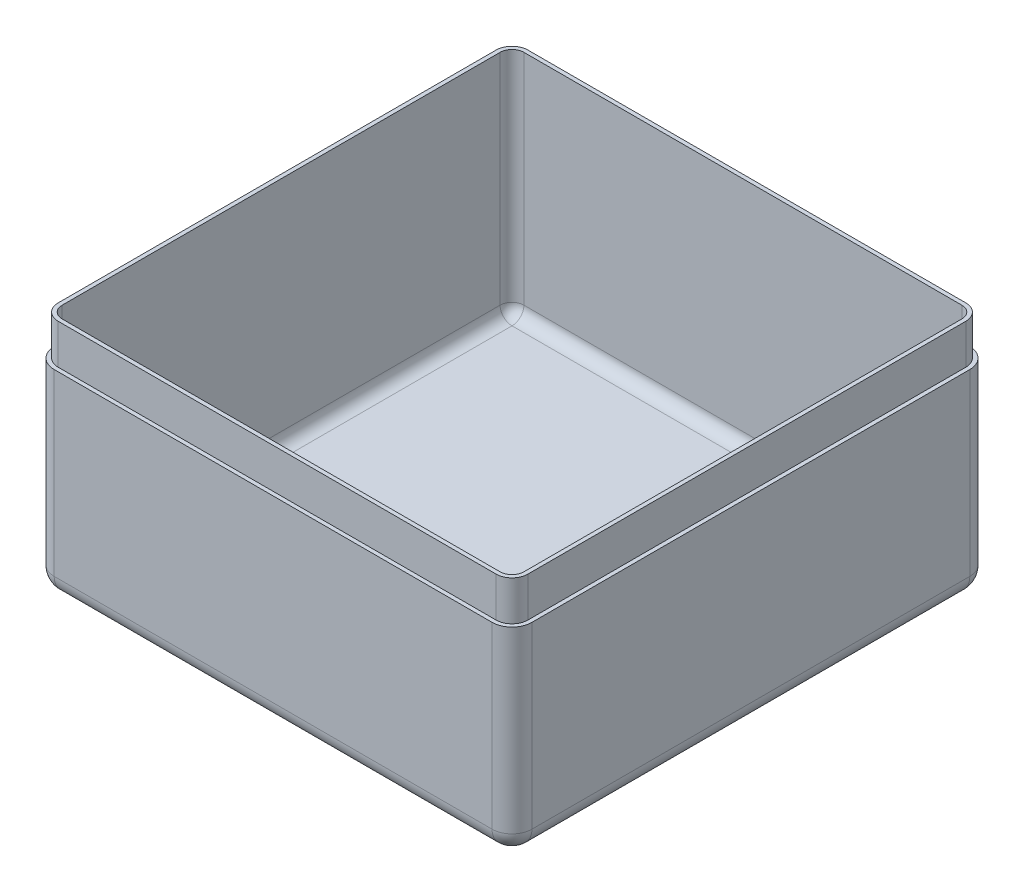
ISO-10303-21;
HEADER;
FILE_DESCRIPTION(('STEP AP214'),'2;1');
FILE_NAME('part.step','',(''),(''),'','','');
FILE_SCHEMA(('AUTOMOTIVE_DESIGN { 1 0 10303 214 1 1 1 1 }'));
ENDSEC;
DATA;
#1=APPLICATION_CONTEXT('core data for automotive mechanical design processes');
#2=APPLICATION_PROTOCOL_DEFINITION('international standard','automotive_design',2000,#1);
#3=PRODUCT_CONTEXT('',#1,'mechanical');
#4=PRODUCT('Part','Part','',(#3));
#5=PRODUCT_RELATED_PRODUCT_CATEGORY('part','',(#4));
#6=PRODUCT_DEFINITION_FORMATION('','',#4);
#7=PRODUCT_DEFINITION_CONTEXT('part definition',#1,'design');
#8=PRODUCT_DEFINITION('design','',#6,#7);
#9=PRODUCT_DEFINITION_SHAPE('','',#8);
#10=(LENGTH_UNIT() NAMED_UNIT(*) SI_UNIT(.MILLI.,.METRE.));
#11=(NAMED_UNIT(*) PLANE_ANGLE_UNIT() SI_UNIT($,.RADIAN.));
#12=(NAMED_UNIT(*) SI_UNIT($,.STERADIAN.) SOLID_ANGLE_UNIT());
#13=UNCERTAINTY_MEASURE_WITH_UNIT(LENGTH_MEASURE(1.E-05),#10,'distance_accuracy_value','');
#14=(GEOMETRIC_REPRESENTATION_CONTEXT(3) GLOBAL_UNCERTAINTY_ASSIGNED_CONTEXT((#13)) GLOBAL_UNIT_ASSIGNED_CONTEXT((#10,
#11,#12)) REPRESENTATION_CONTEXT('',''));
#15=CARTESIAN_POINT('',(0.,0.,0.));
#16=DIRECTION('',(0.,0.,1.));
#17=DIRECTION('',(1.,0.,0.));
#18=AXIS2_PLACEMENT_3D('',#15,#16,#17);
#19=CARTESIAN_POINT('',(0.,25.,0.));
#20=DIRECTION('',(0.,-1.,0.));
#21=DIRECTION('',(0.,0.,-1.));
#22=AXIS2_PLACEMENT_3D('',#19,#20,#21);
#23=PLANE('',#22);
#24=DIRECTION('',(-1.,0.,0.));
#25=VECTOR('',#24,1.);
#26=CARTESIAN_POINT('',(0.,25.,-60.));
#27=LINE('',#26,#25);
#28=CARTESIAN_POINT('',(57.5,25.,-60.));
#29=VERTEX_POINT('',#28);
#30=CARTESIAN_POINT('',(2.49999999999998,25.,-60.));
#31=VERTEX_POINT('',#30);
#32=EDGE_CURVE('E392',#29,#31,#27,.T.);
#33=ORIENTED_EDGE('',*,*,#32,.T.);
#34=CARTESIAN_POINT('',(2.49999999999998,25.,-57.5));
#35=DIRECTION('',(0.,-1.,0.));
#36=DIRECTION('',(0.,0.,-1.));
#37=AXIS2_PLACEMENT_3D('',#34,#35,#36);
#38=CIRCLE('',#37,2.5);
#39=CARTESIAN_POINT('',(0.,25.,-57.5));
#40=VERTEX_POINT('',#39);
#41=EDGE_CURVE('E11',#31,#40,#38,.F.);
#42=ORIENTED_EDGE('',*,*,#41,.T.);
#43=DIRECTION('',(0.,0.,1.));
#44=VECTOR('',#43,1.);
#45=CARTESIAN_POINT('',(0.,25.,0.));
#46=LINE('',#45,#44);
#47=CARTESIAN_POINT('',(0.,25.,-2.5));
#48=VERTEX_POINT('',#47);
#49=EDGE_CURVE('E383',#40,#48,#46,.T.);
#50=ORIENTED_EDGE('',*,*,#49,.T.);
#51=CARTESIAN_POINT('',(2.5,25.,-2.5));
#52=DIRECTION('',(0.,-1.,0.));
#53=DIRECTION('',(0.,0.,-1.));
#54=AXIS2_PLACEMENT_3D('',#51,#52,#53);
#55=CIRCLE('',#54,2.5);
#56=CARTESIAN_POINT('',(2.5,25.,0.));
#57=VERTEX_POINT('',#56);
#58=EDGE_CURVE('E429',#48,#57,#55,.F.);
#59=ORIENTED_EDGE('',*,*,#58,.T.);
#60=DIRECTION('',(1.,0.,0.));
#61=VECTOR('',#60,1.);
#62=CARTESIAN_POINT('',(0.,25.,0.));
#63=LINE('',#62,#61);
#64=CARTESIAN_POINT('',(57.5,25.,0.));
#65=VERTEX_POINT('',#64);
#66=EDGE_CURVE('E386',#57,#65,#63,.T.);
#67=ORIENTED_EDGE('',*,*,#66,.T.);
#68=CARTESIAN_POINT('',(57.5,25.,-2.5));
#69=DIRECTION('',(0.,-1.,0.));
#70=DIRECTION('',(0.,0.,-1.));
#71=AXIS2_PLACEMENT_3D('',#68,#69,#70);
#72=CIRCLE('',#71,2.5);
#73=CARTESIAN_POINT('',(60.,25.,-2.5));
#74=VERTEX_POINT('',#73);
#75=EDGE_CURVE('E431',#65,#74,#72,.F.);
#76=ORIENTED_EDGE('',*,*,#75,.T.);
#77=DIRECTION('',(0.,0.,-1.));
#78=VECTOR('',#77,1.);
#79=CARTESIAN_POINT('',(60.,25.,0.));
#80=LINE('',#79,#78);
#81=CARTESIAN_POINT('',(60.,25.,-57.5));
#82=VERTEX_POINT('',#81);
#83=EDGE_CURVE('E389',#74,#82,#80,.T.);
#84=ORIENTED_EDGE('',*,*,#83,.T.);
#85=CARTESIAN_POINT('',(57.5,25.,-57.5));
#86=DIRECTION('',(0.,-1.,0.));
#87=DIRECTION('',(0.,0.,-1.));
#88=AXIS2_PLACEMENT_3D('',#85,#86,#87);
#89=CIRCLE('',#88,2.5);
#90=EDGE_CURVE('E42',#82,#29,#89,.F.);
#91=ORIENTED_EDGE('',*,*,#90,.T.);
#92=EDGE_LOOP('',(#33,#42,#50,#59,#67,#76,#84,#91));
#93=FACE_BOUND('',#92,.T.);
#94=CARTESIAN_POINT('',(57.5,25.,-57.5));
#95=DIRECTION('',(0.,1.,0.));
#96=DIRECTION('',(0.,0.,1.));
#97=AXIS2_PLACEMENT_3D('',#94,#95,#96);
#98=CIRCLE('',#97,2.);
#99=CARTESIAN_POINT('',(59.5,25.,-57.5));
#100=VERTEX_POINT('',#99);
#101=CARTESIAN_POINT('',(57.5,25.,-59.5));
#102=VERTEX_POINT('',#101);
#103=EDGE_CURVE('E259',#100,#102,#98,.T.);
#104=ORIENTED_EDGE('',*,*,#103,.F.);
#105=DIRECTION('',(0.,0.,-1.));
#106=VECTOR('',#105,1.);
#107=CARTESIAN_POINT('',(59.5,25.,-2.5));
#108=LINE('',#107,#106);
#109=CARTESIAN_POINT('',(59.5,25.,-2.5));
#110=VERTEX_POINT('',#109);
#111=EDGE_CURVE('E264',#110,#100,#108,.T.);
#112=ORIENTED_EDGE('',*,*,#111,.F.);
#113=CARTESIAN_POINT('',(57.5,25.,-2.5));
#114=DIRECTION('',(0.,1.,0.));
#115=DIRECTION('',(0.,0.,1.));
#116=AXIS2_PLACEMENT_3D('',#113,#114,#115);
#117=CIRCLE('',#116,2.);
#118=CARTESIAN_POINT('',(57.5,25.,-0.499999999999999));
#119=VERTEX_POINT('',#118);
#120=EDGE_CURVE('E292',#119,#110,#117,.T.);
#121=ORIENTED_EDGE('',*,*,#120,.F.);
#122=DIRECTION('',(1.,0.,0.));
#123=VECTOR('',#122,1.);
#124=CARTESIAN_POINT('',(2.5,25.,-0.5));
#125=LINE('',#124,#123);
#126=CARTESIAN_POINT('',(2.5,25.,-0.5));
#127=VERTEX_POINT('',#126);
#128=EDGE_CURVE('E289',#127,#119,#125,.T.);
#129=ORIENTED_EDGE('',*,*,#128,.F.);
#130=CARTESIAN_POINT('',(2.5,25.,-2.5));
#131=DIRECTION('',(0.,1.,0.));
#132=DIRECTION('',(0.,0.,1.));
#133=AXIS2_PLACEMENT_3D('',#130,#131,#132);
#134=CIRCLE('',#133,2.);
#135=CARTESIAN_POINT('',(0.499999999999999,25.,-2.5));
#136=VERTEX_POINT('',#135);
#137=EDGE_CURVE('E286',#136,#127,#134,.T.);
#138=ORIENTED_EDGE('',*,*,#137,.F.);
#139=DIRECTION('',(0.,0.,1.));
#140=VECTOR('',#139,1.);
#141=CARTESIAN_POINT('',(0.499999999999979,25.,-57.5));
#142=LINE('',#141,#140);
#143=CARTESIAN_POINT('',(0.499999999999979,25.,-57.5));
#144=VERTEX_POINT('',#143);
#145=EDGE_CURVE('E283',#144,#136,#142,.T.);
#146=ORIENTED_EDGE('',*,*,#145,.F.);
#147=CARTESIAN_POINT('',(2.49999999999998,25.,-57.5));
#148=DIRECTION('',(0.,1.,0.));
#149=DIRECTION('',(0.,0.,1.));
#150=AXIS2_PLACEMENT_3D('',#147,#148,#149);
#151=CIRCLE('',#150,2.);
#152=CARTESIAN_POINT('',(2.49999999999998,25.,-59.5));
#153=VERTEX_POINT('',#152);
#154=EDGE_CURVE('E55',#153,#144,#151,.T.);
#155=ORIENTED_EDGE('',*,*,#154,.F.);
#156=DIRECTION('',(-1.,0.,0.));
#157=VECTOR('',#156,1.);
#158=CARTESIAN_POINT('',(57.5,25.,-59.5));
#159=LINE('',#158,#157);
#160=EDGE_CURVE('E50',#102,#153,#159,.T.);
#161=ORIENTED_EDGE('',*,*,#160,.F.);
#162=EDGE_LOOP('',(#104,#112,#121,#129,#138,#146,#155,#161));
#163=FACE_BOUND('',#162,.T.);
#164=ADVANCED_FACE('F33',(#93,#163),#23,.F.);
#165=CARTESIAN_POINT('',(0.,25.,0.));
#166=DIRECTION('',(1.,0.,0.));
#167=DIRECTION('',(0.,0.,-1.));
#168=AXIS2_PLACEMENT_3D('',#165,#166,#167);
#169=PLANE('',#168);
#170=ORIENTED_EDGE('',*,*,#49,.F.);
#171=DIRECTION('',(0.,-1.,0.));
#172=VECTOR('',#171,1.);
#173=CARTESIAN_POINT('',(0.,25.,-57.5));
#174=LINE('',#173,#172);
#175=CARTESIAN_POINT('',(0.,2.5,-57.5));
#176=VERTEX_POINT('',#175);
#177=EDGE_CURVE('E427',#40,#176,#174,.T.);
#178=ORIENTED_EDGE('',*,*,#177,.T.);
#179=DIRECTION('',(0.,0.,1.));
#180=VECTOR('',#179,1.);
#181=CARTESIAN_POINT('',(0.,2.5,0.));
#182=LINE('',#181,#180);
#183=CARTESIAN_POINT('',(0.,2.5,-2.5));
#184=VERTEX_POINT('',#183);
#185=EDGE_CURVE('E425',#176,#184,#182,.T.);
#186=ORIENTED_EDGE('',*,*,#185,.T.);
#187=DIRECTION('',(0.,-1.,0.));
#188=VECTOR('',#187,1.);
#189=CARTESIAN_POINT('',(0.,25.,-2.5));
#190=LINE('',#189,#188);
#191=EDGE_CURVE('E423',#184,#48,#190,.F.);
#192=ORIENTED_EDGE('',*,*,#191,.T.);
#193=EDGE_LOOP('',(#170,#178,#186,#192));
#194=FACE_BOUND('',#193,.T.);
#195=ADVANCED_FACE('F479',(#194),#169,.F.);
#196=CARTESIAN_POINT('',(0.,25.,0.));
#197=DIRECTION('',(0.,0.,-1.));
#198=DIRECTION('',(-1.,0.,0.));
#199=AXIS2_PLACEMENT_3D('',#196,#197,#198);
#200=PLANE('',#199);
#201=DIRECTION('',(1.,0.,0.));
#202=VECTOR('',#201,1.);
#203=CARTESIAN_POINT('',(60.,2.5,0.));
#204=LINE('',#203,#202);
#205=CARTESIAN_POINT('',(2.5,2.5,0.));
#206=VERTEX_POINT('',#205);
#207=CARTESIAN_POINT('',(57.5,2.5,0.));
#208=VERTEX_POINT('',#207);
#209=EDGE_CURVE('E397',#206,#208,#204,.T.);
#210=ORIENTED_EDGE('',*,*,#209,.T.);
#211=DIRECTION('',(0.,-1.,0.));
#212=VECTOR('',#211,1.);
#213=CARTESIAN_POINT('',(57.5,25.,0.));
#214=LINE('',#213,#212);
#215=EDGE_CURVE('E400',#208,#65,#214,.F.);
#216=ORIENTED_EDGE('',*,*,#215,.T.);
#217=ORIENTED_EDGE('',*,*,#66,.F.);
#218=DIRECTION('',(0.,-1.,0.));
#219=VECTOR('',#218,1.);
#220=CARTESIAN_POINT('',(2.5,25.,0.));
#221=LINE('',#220,#219);
#222=EDGE_CURVE('E395',#57,#206,#221,.T.);
#223=ORIENTED_EDGE('',*,*,#222,.T.);
#224=EDGE_LOOP('',(#210,#216,#217,#223));
#225=FACE_BOUND('',#224,.T.);
#226=ADVANCED_FACE('F491',(#225),#200,.F.);
#227=CARTESIAN_POINT('',(60.,25.,0.));
#228=DIRECTION('',(-1.,0.,0.));
#229=DIRECTION('',(0.,0.,1.));
#230=AXIS2_PLACEMENT_3D('',#227,#228,#229);
#231=PLANE('',#230);
#232=DIRECTION('',(0.,0.,-1.));
#233=VECTOR('',#232,1.);
#234=CARTESIAN_POINT('',(60.,2.5,-60.));
#235=LINE('',#234,#233);
#236=CARTESIAN_POINT('',(60.,2.5,-2.5));
#237=VERTEX_POINT('',#236);
#238=CARTESIAN_POINT('',(60.,2.5,-57.5));
#239=VERTEX_POINT('',#238);
#240=EDGE_CURVE('E413',#237,#239,#235,.T.);
#241=ORIENTED_EDGE('',*,*,#240,.T.);
#242=DIRECTION('',(0.,-1.,0.));
#243=VECTOR('',#242,1.);
#244=CARTESIAN_POINT('',(60.,25.,-57.5));
#245=LINE('',#244,#243);
#246=EDGE_CURVE('E415',#239,#82,#245,.F.);
#247=ORIENTED_EDGE('',*,*,#246,.T.);
#248=ORIENTED_EDGE('',*,*,#83,.F.);
#249=DIRECTION('',(0.,-1.,0.));
#250=VECTOR('',#249,1.);
#251=CARTESIAN_POINT('',(60.,25.,-2.5));
#252=LINE('',#251,#250);
#253=EDGE_CURVE('E411',#74,#237,#252,.T.);
#254=ORIENTED_EDGE('',*,*,#253,.T.);
#255=EDGE_LOOP('',(#241,#247,#248,#254));
#256=FACE_BOUND('',#255,.T.);
#257=ADVANCED_FACE('F501',(#256),#231,.F.);
#258=CARTESIAN_POINT('',(0.,25.,-60.));
#259=DIRECTION('',(0.,0.,1.));
#260=DIRECTION('',(1.,0.,0.));
#261=AXIS2_PLACEMENT_3D('',#258,#259,#260);
#262=PLANE('',#261);
#263=DIRECTION('',(-1.,0.,0.));
#264=VECTOR('',#263,1.);
#265=CARTESIAN_POINT('',(0.,2.5,-60.));
#266=LINE('',#265,#264);
#267=CARTESIAN_POINT('',(57.5,2.5,-60.));
#268=VERTEX_POINT('',#267);
#269=CARTESIAN_POINT('',(2.49999999999998,2.5,-60.));
#270=VERTEX_POINT('',#269);
#271=EDGE_CURVE('E419',#268,#270,#266,.T.);
#272=ORIENTED_EDGE('',*,*,#271,.T.);
#273=DIRECTION('',(0.,-1.,0.));
#274=VECTOR('',#273,1.);
#275=CARTESIAN_POINT('',(2.49999999999998,25.,-60.));
#276=LINE('',#275,#274);
#277=EDGE_CURVE('E421',#270,#31,#276,.F.);
#278=ORIENTED_EDGE('',*,*,#277,.T.);
#279=ORIENTED_EDGE('',*,*,#32,.F.);
#280=DIRECTION('',(0.,-1.,0.));
#281=VECTOR('',#280,1.);
#282=CARTESIAN_POINT('',(57.5,25.,-60.));
#283=LINE('',#282,#281);
#284=EDGE_CURVE('E417',#29,#268,#283,.T.);
#285=ORIENTED_EDGE('',*,*,#284,.T.);
#286=EDGE_LOOP('',(#272,#278,#279,#285));
#287=FACE_BOUND('',#286,.T.);
#288=ADVANCED_FACE('F522',(#287),#262,.F.);
#289=CARTESIAN_POINT('',(0.,0.,0.));
#290=DIRECTION('',(0.,-1.,0.));
#291=DIRECTION('',(0.,0.,-1.));
#292=AXIS2_PLACEMENT_3D('',#289,#290,#291);
#293=PLANE('',#292);
#294=DIRECTION('',(0.,0.,-1.));
#295=VECTOR('',#294,1.);
#296=CARTESIAN_POINT('',(57.5,0.,0.));
#297=LINE('',#296,#295);
#298=CARTESIAN_POINT('',(57.5,0.,-57.5));
#299=VERTEX_POINT('',#298);
#300=CARTESIAN_POINT('',(57.5,0.,-2.5));
#301=VERTEX_POINT('',#300);
#302=EDGE_CURVE('E406',#299,#301,#297,.F.);
#303=ORIENTED_EDGE('',*,*,#302,.T.);
#304=DIRECTION('',(1.,0.,0.));
#305=VECTOR('',#304,1.);
#306=CARTESIAN_POINT('',(0.,0.,-2.5));
#307=LINE('',#306,#305);
#308=CARTESIAN_POINT('',(2.5,0.,-2.5));
#309=VERTEX_POINT('',#308);
#310=EDGE_CURVE('E408',#301,#309,#307,.F.);
#311=ORIENTED_EDGE('',*,*,#310,.T.);
#312=DIRECTION('',(0.,0.,1.));
#313=VECTOR('',#312,1.);
#314=CARTESIAN_POINT('',(2.49999999999998,0.,-60.));
#315=LINE('',#314,#313);
#316=CARTESIAN_POINT('',(2.49999999999998,0.,-57.5));
#317=VERTEX_POINT('',#316);
#318=EDGE_CURVE('E402',#309,#317,#315,.F.);
#319=ORIENTED_EDGE('',*,*,#318,.T.);
#320=DIRECTION('',(-1.,0.,0.));
#321=VECTOR('',#320,1.);
#322=CARTESIAN_POINT('',(60.,0.,-57.5));
#323=LINE('',#322,#321);
#324=EDGE_CURVE('E404',#317,#299,#323,.F.);
#325=ORIENTED_EDGE('',*,*,#324,.T.);
#326=EDGE_LOOP('',(#303,#311,#319,#325));
#327=FACE_BOUND('',#326,.T.);
#328=ADVANCED_FACE('F518',(#327),#293,.T.);
#329=CARTESIAN_POINT('',(2.49999999999998,25.,-57.5));
#330=DIRECTION('',(0.,-1.,0.));
#331=DIRECTION('',(0.,0.,-1.));
#332=AXIS2_PLACEMENT_3D('',#329,#330,#331);
#333=CYLINDRICAL_SURFACE('',#332,2.5);
#334=ORIENTED_EDGE('',*,*,#41,.F.);
#335=ORIENTED_EDGE('',*,*,#277,.F.);
#336=CARTESIAN_POINT('',(2.49999999999998,2.5,-57.5));
#337=DIRECTION('',(0.,-1.,0.));
#338=DIRECTION('',(0.,0.,-1.));
#339=AXIS2_PLACEMENT_3D('',#336,#337,#338);
#340=CIRCLE('',#339,2.5);
#341=EDGE_CURVE('E460',#176,#270,#340,.T.);
#342=ORIENTED_EDGE('',*,*,#341,.F.);
#343=ORIENTED_EDGE('',*,*,#177,.F.);
#344=EDGE_LOOP('',(#334,#335,#342,#343));
#345=FACE_BOUND('',#344,.T.);
#346=ADVANCED_FACE('F35',(#345),#333,.T.);
#347=CARTESIAN_POINT('',(57.5,25.,-57.5));
#348=DIRECTION('',(0.,-1.,0.));
#349=DIRECTION('',(0.,0.,-1.));
#350=AXIS2_PLACEMENT_3D('',#347,#348,#349);
#351=CYLINDRICAL_SURFACE('',#350,2.5);
#352=ORIENTED_EDGE('',*,*,#90,.F.);
#353=ORIENTED_EDGE('',*,*,#246,.F.);
#354=CARTESIAN_POINT('',(57.5,2.5,-57.5));
#355=DIRECTION('',(0.,-1.,0.));
#356=DIRECTION('',(0.,0.,-1.));
#357=AXIS2_PLACEMENT_3D('',#354,#355,#356);
#358=CIRCLE('',#357,2.5);
#359=EDGE_CURVE('E458',#268,#239,#358,.T.);
#360=ORIENTED_EDGE('',*,*,#359,.F.);
#361=ORIENTED_EDGE('',*,*,#284,.F.);
#362=EDGE_LOOP('',(#352,#353,#360,#361));
#363=FACE_BOUND('',#362,.T.);
#364=ADVANCED_FACE('F506',(#363),#351,.T.);
#365=CARTESIAN_POINT('',(0.,2.5,-57.5));
#366=DIRECTION('',(1.,0.,0.));
#367=DIRECTION('',(0.,0.,-1.));
#368=AXIS2_PLACEMENT_3D('',#365,#366,#367);
#369=CYLINDRICAL_SURFACE('',#368,2.5);
#370=CARTESIAN_POINT('',(2.49999999999998,2.5,-57.5));
#371=DIRECTION('',(-1.,0.,0.));
#372=DIRECTION('',(0.,0.,1.));
#373=AXIS2_PLACEMENT_3D('',#370,#371,#372);
#374=CIRCLE('',#373,2.5);
#375=EDGE_CURVE('E37',#270,#317,#374,.T.);
#376=ORIENTED_EDGE('',*,*,#375,.F.);
#377=ORIENTED_EDGE('',*,*,#271,.F.);
#378=CARTESIAN_POINT('',(57.5,2.5,-57.5));
#379=DIRECTION('',(1.,0.,0.));
#380=DIRECTION('',(0.,0.,-1.));
#381=AXIS2_PLACEMENT_3D('',#378,#379,#380);
#382=CIRCLE('',#381,2.5);
#383=EDGE_CURVE('E455',#299,#268,#382,.T.);
#384=ORIENTED_EDGE('',*,*,#383,.F.);
#385=ORIENTED_EDGE('',*,*,#324,.F.);
#386=EDGE_LOOP('',(#376,#377,#384,#385));
#387=FACE_BOUND('',#386,.T.);
#388=ADVANCED_FACE('F519',(#387),#369,.T.);
#389=CARTESIAN_POINT('',(2.49999999999998,2.5,-57.5));
#390=DIRECTION('',(0.,0.,1.));
#391=DIRECTION('',(1.,0.,0.));
#392=AXIS2_PLACEMENT_3D('',#389,#390,#391);
#393=SPHERICAL_SURFACE('',#392,2.5);
#394=ORIENTED_EDGE('',*,*,#341,.T.);
#395=ORIENTED_EDGE('',*,*,#375,.T.);
#396=CARTESIAN_POINT('',(2.49999999999998,2.5,-57.5));
#397=DIRECTION('',(0.,0.,-1.));
#398=DIRECTION('',(-1.,0.,0.));
#399=AXIS2_PLACEMENT_3D('',#396,#397,#398);
#400=CIRCLE('',#399,2.5);
#401=EDGE_CURVE('E452',#176,#317,#400,.F.);
#402=ORIENTED_EDGE('',*,*,#401,.F.);
#403=EDGE_LOOP('',(#394,#395,#402));
#404=FACE_BOUND('',#403,.T.);
#405=ADVANCED_FACE('F467',(#404),#393,.T.);
#406=CARTESIAN_POINT('',(57.5,2.5,-57.5));
#407=DIRECTION('',(0.,0.,1.));
#408=DIRECTION('',(1.,0.,0.));
#409=AXIS2_PLACEMENT_3D('',#406,#407,#408);
#410=SPHERICAL_SURFACE('',#409,2.5);
#411=ORIENTED_EDGE('',*,*,#383,.T.);
#412=ORIENTED_EDGE('',*,*,#359,.T.);
#413=CARTESIAN_POINT('',(57.5,2.5,-57.5));
#414=DIRECTION('',(0.,0.,-1.));
#415=DIRECTION('',(-1.,0.,0.));
#416=AXIS2_PLACEMENT_3D('',#413,#414,#415);
#417=CIRCLE('',#416,2.5);
#418=EDGE_CURVE('E449',#299,#239,#417,.F.);
#419=ORIENTED_EDGE('',*,*,#418,.F.);
#420=EDGE_LOOP('',(#411,#412,#419));
#421=FACE_BOUND('',#420,.T.);
#422=ADVANCED_FACE('F510',(#421),#410,.T.);
#423=CARTESIAN_POINT('',(2.5,2.5,0.));
#424=DIRECTION('',(0.,0.,-1.));
#425=DIRECTION('',(-1.,0.,0.));
#426=AXIS2_PLACEMENT_3D('',#423,#424,#425);
#427=CYLINDRICAL_SURFACE('',#426,2.5);
#428=ORIENTED_EDGE('',*,*,#401,.T.);
#429=ORIENTED_EDGE('',*,*,#318,.F.);
#430=CARTESIAN_POINT('',(2.5,2.5,-2.5));
#431=DIRECTION('',(0.,0.,1.));
#432=DIRECTION('',(1.,0.,0.));
#433=AXIS2_PLACEMENT_3D('',#430,#431,#432);
#434=CIRCLE('',#433,2.5);
#435=EDGE_CURVE('E446',#184,#309,#434,.T.);
#436=ORIENTED_EDGE('',*,*,#435,.F.);
#437=ORIENTED_EDGE('',*,*,#185,.F.);
#438=EDGE_LOOP('',(#428,#429,#436,#437));
#439=FACE_BOUND('',#438,.T.);
#440=ADVANCED_FACE('F474',(#439),#427,.T.);
#441=CARTESIAN_POINT('',(2.5,25.,-2.5));
#442=DIRECTION('',(0.,-1.,0.));
#443=DIRECTION('',(0.,0.,-1.));
#444=AXIS2_PLACEMENT_3D('',#441,#442,#443);
#445=CYLINDRICAL_SURFACE('',#444,2.5);
#446=ORIENTED_EDGE('',*,*,#58,.F.);
#447=ORIENTED_EDGE('',*,*,#191,.F.);
#448=CARTESIAN_POINT('',(2.5,2.5,-2.5));
#449=DIRECTION('',(0.,-1.,0.));
#450=DIRECTION('',(0.,0.,-1.));
#451=AXIS2_PLACEMENT_3D('',#448,#449,#450);
#452=CIRCLE('',#451,2.5);
#453=EDGE_CURVE('E443',#206,#184,#452,.T.);
#454=ORIENTED_EDGE('',*,*,#453,.F.);
#455=ORIENTED_EDGE('',*,*,#222,.F.);
#456=EDGE_LOOP('',(#446,#447,#454,#455));
#457=FACE_BOUND('',#456,.T.);
#458=ADVANCED_FACE('F484',(#457),#445,.T.);
#459=CARTESIAN_POINT('',(57.5,25.,-2.5));
#460=DIRECTION('',(0.,-1.,0.));
#461=DIRECTION('',(0.,0.,-1.));
#462=AXIS2_PLACEMENT_3D('',#459,#460,#461);
#463=CYLINDRICAL_SURFACE('',#462,2.5);
#464=ORIENTED_EDGE('',*,*,#75,.F.);
#465=ORIENTED_EDGE('',*,*,#215,.F.);
#466=CARTESIAN_POINT('',(57.5,2.5,-2.5));
#467=DIRECTION('',(0.,-1.,0.));
#468=DIRECTION('',(0.,0.,-1.));
#469=AXIS2_PLACEMENT_3D('',#466,#467,#468);
#470=CIRCLE('',#469,2.5);
#471=EDGE_CURVE('E440',#237,#208,#470,.T.);
#472=ORIENTED_EDGE('',*,*,#471,.F.);
#473=ORIENTED_EDGE('',*,*,#253,.F.);
#474=EDGE_LOOP('',(#464,#465,#472,#473));
#475=FACE_BOUND('',#474,.T.);
#476=ADVANCED_FACE('F496',(#475),#463,.T.);
#477=CARTESIAN_POINT('',(57.5,2.5,0.));
#478=DIRECTION('',(0.,0.,1.));
#479=DIRECTION('',(1.,0.,0.));
#480=AXIS2_PLACEMENT_3D('',#477,#478,#479);
#481=CYLINDRICAL_SURFACE('',#480,2.5);
#482=ORIENTED_EDGE('',*,*,#418,.T.);
#483=ORIENTED_EDGE('',*,*,#240,.F.);
#484=CARTESIAN_POINT('',(57.5,2.5,-2.5));
#485=DIRECTION('',(0.,0.,1.));
#486=DIRECTION('',(1.,0.,0.));
#487=AXIS2_PLACEMENT_3D('',#484,#485,#486);
#488=CIRCLE('',#487,2.5);
#489=EDGE_CURVE('E437',#301,#237,#488,.T.);
#490=ORIENTED_EDGE('',*,*,#489,.F.);
#491=ORIENTED_EDGE('',*,*,#302,.F.);
#492=EDGE_LOOP('',(#482,#483,#490,#491));
#493=FACE_BOUND('',#492,.T.);
#494=ADVANCED_FACE('F514',(#493),#481,.T.);
#495=CARTESIAN_POINT('',(2.5,2.5,-2.5));
#496=DIRECTION('',(0.,0.,1.));
#497=DIRECTION('',(1.,0.,0.));
#498=AXIS2_PLACEMENT_3D('',#495,#496,#497);
#499=SPHERICAL_SURFACE('',#498,2.5);
#500=ORIENTED_EDGE('',*,*,#453,.T.);
#501=ORIENTED_EDGE('',*,*,#435,.T.);
#502=CARTESIAN_POINT('',(2.5,2.5,-2.5));
#503=DIRECTION('',(-1.,0.,0.));
#504=DIRECTION('',(0.,0.,1.));
#505=AXIS2_PLACEMENT_3D('',#502,#503,#504);
#506=CIRCLE('',#505,2.5);
#507=EDGE_CURVE('E435',#206,#309,#506,.F.);
#508=ORIENTED_EDGE('',*,*,#507,.F.);
#509=EDGE_LOOP('',(#500,#501,#508));
#510=FACE_BOUND('',#509,.T.);
#511=ADVANCED_FACE('F555',(#510),#499,.T.);
#512=CARTESIAN_POINT('',(57.5,2.5,-2.5));
#513=DIRECTION('',(0.,0.,1.));
#514=DIRECTION('',(1.,0.,0.));
#515=AXIS2_PLACEMENT_3D('',#512,#513,#514);
#516=SPHERICAL_SURFACE('',#515,2.5);
#517=ORIENTED_EDGE('',*,*,#489,.T.);
#518=ORIENTED_EDGE('',*,*,#471,.T.);
#519=CARTESIAN_POINT('',(57.5,2.5,-2.5));
#520=DIRECTION('',(1.,0.,0.));
#521=DIRECTION('',(0.,0.,-1.));
#522=AXIS2_PLACEMENT_3D('',#519,#520,#521);
#523=CIRCLE('',#522,2.5);
#524=EDGE_CURVE('E322',#301,#208,#523,.F.);
#525=ORIENTED_EDGE('',*,*,#524,.F.);
#526=EDGE_LOOP('',(#517,#518,#525));
#527=FACE_BOUND('',#526,.T.);
#528=ADVANCED_FACE('F551',(#527),#516,.T.);
#529=CARTESIAN_POINT('',(0.,2.5,-2.5));
#530=DIRECTION('',(-1.,0.,0.));
#531=DIRECTION('',(0.,0.,1.));
#532=AXIS2_PLACEMENT_3D('',#529,#530,#531);
#533=CYLINDRICAL_SURFACE('',#532,2.5);
#534=ORIENTED_EDGE('',*,*,#507,.T.);
#535=ORIENTED_EDGE('',*,*,#310,.F.);
#536=ORIENTED_EDGE('',*,*,#524,.T.);
#537=ORIENTED_EDGE('',*,*,#209,.F.);
#538=EDGE_LOOP('',(#534,#535,#536,#537));
#539=FACE_BOUND('',#538,.T.);
#540=ADVANCED_FACE('F548',(#539),#533,.T.);
#541=CARTESIAN_POINT('',(57.5,30.,-57.5));
#542=DIRECTION('',(0.,1.,0.));
#543=DIRECTION('',(0.,0.,1.));
#544=AXIS2_PLACEMENT_3D('',#541,#542,#543);
#545=PLANE('',#544);
#546=CARTESIAN_POINT('',(57.5,30.,-57.5));
#547=DIRECTION('',(0.,1.,0.));
#548=DIRECTION('',(0.,0.,1.));
#549=AXIS2_PLACEMENT_3D('',#546,#547,#548);
#550=CIRCLE('',#549,2.);
#551=CARTESIAN_POINT('',(59.5,30.,-57.5));
#552=VERTEX_POINT('',#551);
#553=CARTESIAN_POINT('',(57.5,30.,-59.5));
#554=VERTEX_POINT('',#553);
#555=EDGE_CURVE('E260',#552,#554,#550,.T.);
#556=ORIENTED_EDGE('',*,*,#555,.T.);
#557=DIRECTION('',(-1.,0.,0.));
#558=VECTOR('',#557,1.);
#559=CARTESIAN_POINT('',(57.5,30.,-59.5));
#560=LINE('',#559,#558);
#561=CARTESIAN_POINT('',(2.49999999999998,30.,-59.5));
#562=VERTEX_POINT('',#561);
#563=EDGE_CURVE('E263',#554,#562,#560,.T.);
#564=ORIENTED_EDGE('',*,*,#563,.T.);
#565=CARTESIAN_POINT('',(2.49999999999998,30.,-57.5));
#566=DIRECTION('',(0.,1.,0.));
#567=DIRECTION('',(0.,0.,1.));
#568=AXIS2_PLACEMENT_3D('',#565,#566,#567);
#569=CIRCLE('',#568,2.);
#570=CARTESIAN_POINT('',(0.499999999999978,30.,-57.5));
#571=VERTEX_POINT('',#570);
#572=EDGE_CURVE('E266',#562,#571,#569,.T.);
#573=ORIENTED_EDGE('',*,*,#572,.T.);
#574=DIRECTION('',(0.,0.,1.));
#575=VECTOR('',#574,1.);
#576=CARTESIAN_POINT('',(0.499999999999979,30.,-57.5));
#577=LINE('',#576,#575);
#578=CARTESIAN_POINT('',(0.499999999999999,30.,-2.5));
#579=VERTEX_POINT('',#578);
#580=EDGE_CURVE('E268',#571,#579,#577,.T.);
#581=ORIENTED_EDGE('',*,*,#580,.T.);
#582=CARTESIAN_POINT('',(2.5,30.,-2.5));
#583=DIRECTION('',(0.,1.,0.));
#584=DIRECTION('',(0.,0.,1.));
#585=AXIS2_PLACEMENT_3D('',#582,#583,#584);
#586=CIRCLE('',#585,2.);
#587=CARTESIAN_POINT('',(2.5,30.,-0.5));
#588=VERTEX_POINT('',#587);
#589=EDGE_CURVE('E270',#579,#588,#586,.T.);
#590=ORIENTED_EDGE('',*,*,#589,.T.);
#591=DIRECTION('',(1.,0.,0.));
#592=VECTOR('',#591,1.);
#593=CARTESIAN_POINT('',(2.5,30.,-0.5));
#594=LINE('',#593,#592);
#595=CARTESIAN_POINT('',(57.5,30.,-0.5));
#596=VERTEX_POINT('',#595);
#597=EDGE_CURVE('E272',#588,#596,#594,.T.);
#598=ORIENTED_EDGE('',*,*,#597,.T.);
#599=CARTESIAN_POINT('',(57.5,30.,-2.5));
#600=DIRECTION('',(0.,1.,0.));
#601=DIRECTION('',(0.,0.,1.));
#602=AXIS2_PLACEMENT_3D('',#599,#600,#601);
#603=CIRCLE('',#602,2.);
#604=CARTESIAN_POINT('',(59.5,30.,-2.5));
#605=VERTEX_POINT('',#604);
#606=EDGE_CURVE('E274',#596,#605,#603,.T.);
#607=ORIENTED_EDGE('',*,*,#606,.T.);
#608=DIRECTION('',(0.,0.,-1.));
#609=VECTOR('',#608,1.);
#610=CARTESIAN_POINT('',(59.5,30.,-2.5));
#611=LINE('',#610,#609);
#612=EDGE_CURVE('E276',#605,#552,#611,.T.);
#613=ORIENTED_EDGE('',*,*,#612,.T.);
#614=EDGE_LOOP('',(#556,#564,#573,#581,#590,#598,#607,#613));
#615=FACE_BOUND('',#614,.T.);
#616=DIRECTION('',(-1.,0.,0.));
#617=VECTOR('',#616,1.);
#618=CARTESIAN_POINT('',(57.5,30.,-59.));
#619=LINE('',#618,#617);
#620=CARTESIAN_POINT('',(57.5,30.,-59.));
#621=VERTEX_POINT('',#620);
#622=CARTESIAN_POINT('',(2.49999999999998,30.,-59.));
#623=VERTEX_POINT('',#622);
#624=EDGE_CURVE('E222',#621,#623,#619,.T.);
#625=ORIENTED_EDGE('',*,*,#624,.F.);
#626=CARTESIAN_POINT('',(57.5,30.,-57.5));
#627=DIRECTION('',(0.,1.,0.));
#628=DIRECTION('',(0.,0.,1.));
#629=AXIS2_PLACEMENT_3D('',#626,#627,#628);
#630=CIRCLE('',#629,1.5);
#631=CARTESIAN_POINT('',(59.,30.,-57.5));
#632=VERTEX_POINT('',#631);
#633=EDGE_CURVE('E231',#632,#621,#630,.T.);
#634=ORIENTED_EDGE('',*,*,#633,.F.);
#635=DIRECTION('',(0.,0.,-1.));
#636=VECTOR('',#635,1.);
#637=CARTESIAN_POINT('',(59.,30.,-2.5));
#638=LINE('',#637,#636);
#639=CARTESIAN_POINT('',(59.,30.,-2.5));
#640=VERTEX_POINT('',#639);
#641=EDGE_CURVE('E257',#640,#632,#638,.T.);
#642=ORIENTED_EDGE('',*,*,#641,.F.);
#643=CARTESIAN_POINT('',(57.5,30.,-2.5));
#644=DIRECTION('',(0.,1.,0.));
#645=DIRECTION('',(0.,0.,1.));
#646=AXIS2_PLACEMENT_3D('',#643,#644,#645);
#647=CIRCLE('',#646,1.5);
#648=CARTESIAN_POINT('',(57.5,30.,-1.));
#649=VERTEX_POINT('',#648);
#650=EDGE_CURVE('E254',#649,#640,#647,.T.);
#651=ORIENTED_EDGE('',*,*,#650,.F.);
#652=DIRECTION('',(1.,0.,0.));
#653=VECTOR('',#652,1.);
#654=CARTESIAN_POINT('',(2.5,30.,-1.));
#655=LINE('',#654,#653);
#656=CARTESIAN_POINT('',(2.5,30.,-1.));
#657=VERTEX_POINT('',#656);
#658=EDGE_CURVE('E251',#657,#649,#655,.T.);
#659=ORIENTED_EDGE('',*,*,#658,.F.);
#660=CARTESIAN_POINT('',(2.5,30.,-2.5));
#661=DIRECTION('',(0.,1.,0.));
#662=DIRECTION('',(0.,0.,1.));
#663=AXIS2_PLACEMENT_3D('',#660,#661,#662);
#664=CIRCLE('',#663,1.5);
#665=CARTESIAN_POINT('',(0.999999999999999,30.,-2.5));
#666=VERTEX_POINT('',#665);
#667=EDGE_CURVE('E248',#666,#657,#664,.T.);
#668=ORIENTED_EDGE('',*,*,#667,.F.);
#669=DIRECTION('',(0.,0.,1.));
#670=VECTOR('',#669,1.);
#671=CARTESIAN_POINT('',(0.999999999999979,30.,-57.5));
#672=LINE('',#671,#670);
#673=CARTESIAN_POINT('',(0.999999999999979,30.,-57.5));
#674=VERTEX_POINT('',#673);
#675=EDGE_CURVE('E243',#674,#666,#672,.T.);
#676=ORIENTED_EDGE('',*,*,#675,.F.);
#677=CARTESIAN_POINT('',(2.49999999999998,30.,-57.5));
#678=DIRECTION('',(0.,1.,0.));
#679=DIRECTION('',(0.,0.,1.));
#680=AXIS2_PLACEMENT_3D('',#677,#678,#679);
#681=CIRCLE('',#680,1.5);
#682=EDGE_CURVE('E241',#623,#674,#681,.T.);
#683=ORIENTED_EDGE('',*,*,#682,.F.);
#684=EDGE_LOOP('',(#625,#634,#642,#651,#659,#668,#676,#683));
#685=FACE_BOUND('',#684,.T.);
#686=ADVANCED_FACE('F238',(#615,#685),#545,.T.);
#687=CARTESIAN_POINT('',(57.5,30.,-57.5));
#688=DIRECTION('',(0.,-1.,0.));
#689=DIRECTION('',(0.,0.,-1.));
#690=AXIS2_PLACEMENT_3D('',#687,#688,#689);
#691=CYLINDRICAL_SURFACE('',#690,2.);
#692=ORIENTED_EDGE('',*,*,#103,.T.);
#693=DIRECTION('',(0.,-1.,0.));
#694=VECTOR('',#693,1.);
#695=CARTESIAN_POINT('',(57.5,30.,-59.5));
#696=LINE('',#695,#694);
#697=EDGE_CURVE('E317',#554,#102,#696,.T.);
#698=ORIENTED_EDGE('',*,*,#697,.F.);
#699=ORIENTED_EDGE('',*,*,#555,.F.);
#700=DIRECTION('',(0.,-1.,0.));
#701=VECTOR('',#700,1.);
#702=CARTESIAN_POINT('',(59.5,30.,-57.5));
#703=LINE('',#702,#701);
#704=EDGE_CURVE('E278',#552,#100,#703,.T.);
#705=ORIENTED_EDGE('',*,*,#704,.T.);
#706=EDGE_LOOP('',(#692,#698,#699,#705));
#707=FACE_BOUND('',#706,.T.);
#708=ADVANCED_FACE('F620',(#707),#691,.T.);
#709=CARTESIAN_POINT('',(57.5,30.,-59.5));
#710=DIRECTION('',(0.,0.,1.));
#711=DIRECTION('',(1.,0.,0.));
#712=AXIS2_PLACEMENT_3D('',#709,#710,#711);
#713=PLANE('',#712);
#714=ORIENTED_EDGE('',*,*,#160,.T.);
#715=DIRECTION('',(0.,-1.,0.));
#716=VECTOR('',#715,1.);
#717=CARTESIAN_POINT('',(2.49999999999998,30.,-59.5));
#718=LINE('',#717,#716);
#719=EDGE_CURVE('E314',#562,#153,#718,.T.);
#720=ORIENTED_EDGE('',*,*,#719,.F.);
#721=ORIENTED_EDGE('',*,*,#563,.F.);
#722=ORIENTED_EDGE('',*,*,#697,.T.);
#723=EDGE_LOOP('',(#714,#720,#721,#722));
#724=FACE_BOUND('',#723,.T.);
#725=ADVANCED_FACE('F628',(#724),#713,.F.);
#726=CARTESIAN_POINT('',(2.49999999999998,30.,-57.5));
#727=DIRECTION('',(0.,-1.,0.));
#728=DIRECTION('',(0.,0.,-1.));
#729=AXIS2_PLACEMENT_3D('',#726,#727,#728);
#730=CYLINDRICAL_SURFACE('',#729,2.);
#731=ORIENTED_EDGE('',*,*,#154,.T.);
#732=DIRECTION('',(0.,-1.,0.));
#733=VECTOR('',#732,1.);
#734=CARTESIAN_POINT('',(0.499999999999978,30.,-57.5));
#735=LINE('',#734,#733);
#736=EDGE_CURVE('E311',#571,#144,#735,.T.);
#737=ORIENTED_EDGE('',*,*,#736,.F.);
#738=ORIENTED_EDGE('',*,*,#572,.F.);
#739=ORIENTED_EDGE('',*,*,#719,.T.);
#740=EDGE_LOOP('',(#731,#737,#738,#739));
#741=FACE_BOUND('',#740,.T.);
#742=ADVANCED_FACE('F636',(#741),#730,.T.);
#743=CARTESIAN_POINT('',(0.499999999999979,30.,-57.5));
#744=DIRECTION('',(1.,0.,0.));
#745=DIRECTION('',(0.,0.,-1.));
#746=AXIS2_PLACEMENT_3D('',#743,#744,#745);
#747=PLANE('',#746);
#748=ORIENTED_EDGE('',*,*,#145,.T.);
#749=DIRECTION('',(0.,-1.,0.));
#750=VECTOR('',#749,1.);
#751=CARTESIAN_POINT('',(0.499999999999999,30.,-2.5));
#752=LINE('',#751,#750);
#753=EDGE_CURVE('E308',#579,#136,#752,.T.);
#754=ORIENTED_EDGE('',*,*,#753,.F.);
#755=ORIENTED_EDGE('',*,*,#580,.F.);
#756=ORIENTED_EDGE('',*,*,#736,.T.);
#757=EDGE_LOOP('',(#748,#754,#755,#756));
#758=FACE_BOUND('',#757,.T.);
#759=ADVANCED_FACE('F644',(#758),#747,.F.);
#760=CARTESIAN_POINT('',(2.5,30.,-2.5));
#761=DIRECTION('',(0.,-1.,0.));
#762=DIRECTION('',(0.,0.,-1.));
#763=AXIS2_PLACEMENT_3D('',#760,#761,#762);
#764=CYLINDRICAL_SURFACE('',#763,2.);
#765=ORIENTED_EDGE('',*,*,#137,.T.);
#766=DIRECTION('',(0.,-1.,0.));
#767=VECTOR('',#766,1.);
#768=CARTESIAN_POINT('',(2.5,30.,-0.5));
#769=LINE('',#768,#767);
#770=EDGE_CURVE('E305',#588,#127,#769,.T.);
#771=ORIENTED_EDGE('',*,*,#770,.F.);
#772=ORIENTED_EDGE('',*,*,#589,.F.);
#773=ORIENTED_EDGE('',*,*,#753,.T.);
#774=EDGE_LOOP('',(#765,#771,#772,#773));
#775=FACE_BOUND('',#774,.T.);
#776=ADVANCED_FACE('F652',(#775),#764,.T.);
#777=CARTESIAN_POINT('',(2.5,30.,-0.5));
#778=DIRECTION('',(0.,0.,-1.));
#779=DIRECTION('',(-1.,0.,0.));
#780=AXIS2_PLACEMENT_3D('',#777,#778,#779);
#781=PLANE('',#780);
#782=ORIENTED_EDGE('',*,*,#128,.T.);
#783=DIRECTION('',(0.,-1.,0.));
#784=VECTOR('',#783,1.);
#785=CARTESIAN_POINT('',(57.5,30.,-0.5));
#786=LINE('',#785,#784);
#787=EDGE_CURVE('E302',#596,#119,#786,.T.);
#788=ORIENTED_EDGE('',*,*,#787,.F.);
#789=ORIENTED_EDGE('',*,*,#597,.F.);
#790=ORIENTED_EDGE('',*,*,#770,.T.);
#791=EDGE_LOOP('',(#782,#788,#789,#790));
#792=FACE_BOUND('',#791,.T.);
#793=ADVANCED_FACE('F660',(#792),#781,.F.);
#794=CARTESIAN_POINT('',(57.5,30.,-2.5));
#795=DIRECTION('',(0.,-1.,0.));
#796=DIRECTION('',(0.,0.,-1.));
#797=AXIS2_PLACEMENT_3D('',#794,#795,#796);
#798=CYLINDRICAL_SURFACE('',#797,2.);
#799=ORIENTED_EDGE('',*,*,#120,.T.);
#800=DIRECTION('',(0.,-1.,0.));
#801=VECTOR('',#800,1.);
#802=CARTESIAN_POINT('',(59.5,30.,-2.5));
#803=LINE('',#802,#801);
#804=EDGE_CURVE('E299',#605,#110,#803,.T.);
#805=ORIENTED_EDGE('',*,*,#804,.F.);
#806=ORIENTED_EDGE('',*,*,#606,.F.);
#807=ORIENTED_EDGE('',*,*,#787,.T.);
#808=EDGE_LOOP('',(#799,#805,#806,#807));
#809=FACE_BOUND('',#808,.T.);
#810=ADVANCED_FACE('F668',(#809),#798,.T.);
#811=CARTESIAN_POINT('',(59.5,30.,-2.5));
#812=DIRECTION('',(-1.,0.,0.));
#813=DIRECTION('',(0.,0.,1.));
#814=AXIS2_PLACEMENT_3D('',#811,#812,#813);
#815=PLANE('',#814);
#816=ORIENTED_EDGE('',*,*,#111,.T.);
#817=ORIENTED_EDGE('',*,*,#704,.F.);
#818=ORIENTED_EDGE('',*,*,#612,.F.);
#819=ORIENTED_EDGE('',*,*,#804,.T.);
#820=EDGE_LOOP('',(#816,#817,#818,#819));
#821=FACE_BOUND('',#820,.T.);
#822=ADVANCED_FACE('F676',(#821),#815,.F.);
#823=CARTESIAN_POINT('',(0.,1.,0.));
#824=DIRECTION('',(0.,-1.,0.));
#825=DIRECTION('',(0.,0.,-1.));
#826=AXIS2_PLACEMENT_3D('',#823,#824,#825);
#827=PLANE('',#826);
#828=DIRECTION('',(0.,0.,-1.));
#829=VECTOR('',#828,1.);
#830=CARTESIAN_POINT('',(57.5,1.,0.));
#831=LINE('',#830,#829);
#832=CARTESIAN_POINT('',(57.5,1.,-57.5));
#833=VERTEX_POINT('',#832);
#834=CARTESIAN_POINT('',(57.5,1.,-2.5));
#835=VERTEX_POINT('',#834);
#836=EDGE_CURVE('E350',#833,#835,#831,.F.);
#837=ORIENTED_EDGE('',*,*,#836,.F.);
#838=DIRECTION('',(1.,0.,0.));
#839=VECTOR('',#838,1.);
#840=CARTESIAN_POINT('',(0.,1.,-57.5));
#841=LINE('',#840,#839);
#842=CARTESIAN_POINT('',(2.49999999999998,1.,-57.5));
#843=VERTEX_POINT('',#842);
#844=EDGE_CURVE('E352',#843,#833,#841,.T.);
#845=ORIENTED_EDGE('',*,*,#844,.F.);
#846=DIRECTION('',(0.,0.,-1.));
#847=VECTOR('',#846,1.);
#848=CARTESIAN_POINT('',(2.5,1.,0.));
#849=LINE('',#848,#847);
#850=CARTESIAN_POINT('',(2.5,0.999999999999999,-2.5));
#851=VERTEX_POINT('',#850);
#852=EDGE_CURVE('E355',#851,#843,#849,.T.);
#853=ORIENTED_EDGE('',*,*,#852,.F.);
#854=DIRECTION('',(1.,0.,0.));
#855=VECTOR('',#854,1.);
#856=CARTESIAN_POINT('',(0.,1.,-2.5));
#857=LINE('',#856,#855);
#858=EDGE_CURVE('E342',#835,#851,#857,.F.);
#859=ORIENTED_EDGE('',*,*,#858,.F.);
#860=EDGE_LOOP('',(#837,#845,#853,#859));
#861=FACE_BOUND('',#860,.T.);
#862=ADVANCED_FACE('F684',(#861),#827,.F.);
#863=CARTESIAN_POINT('',(2.5,2.5,0.));
#864=DIRECTION('',(0.,0.,-1.));
#865=DIRECTION('',(-1.,0.,0.));
#866=AXIS2_PLACEMENT_3D('',#863,#864,#865);
#867=CYLINDRICAL_SURFACE('',#866,1.5);
#868=CARTESIAN_POINT('',(2.49999999999998,2.5,-57.5));
#869=DIRECTION('',(0.,0.,-1.));
#870=DIRECTION('',(-1.,0.,0.));
#871=AXIS2_PLACEMENT_3D('',#868,#869,#870);
#872=CIRCLE('',#871,1.5);
#873=CARTESIAN_POINT('',(0.99999999999998,2.5,-57.5));
#874=VERTEX_POINT('',#873);
#875=EDGE_CURVE('E345',#874,#843,#872,.F.);
#876=ORIENTED_EDGE('',*,*,#875,.F.);
#877=DIRECTION('',(0.,0.,-1.));
#878=VECTOR('',#877,1.);
#879=CARTESIAN_POINT('',(1.,2.5,0.));
#880=LINE('',#879,#878);
#881=CARTESIAN_POINT('',(0.999999999999999,2.5,-2.5));
#882=VERTEX_POINT('',#881);
#883=EDGE_CURVE('E323',#874,#882,#880,.F.);
#884=ORIENTED_EDGE('',*,*,#883,.T.);
#885=CARTESIAN_POINT('',(2.5,2.5,-2.5));
#886=DIRECTION('',(0.,0.,1.));
#887=DIRECTION('',(1.,0.,0.));
#888=AXIS2_PLACEMENT_3D('',#885,#886,#887);
#889=CIRCLE('',#888,1.5);
#890=EDGE_CURVE('E349',#882,#851,#889,.T.);
#891=ORIENTED_EDGE('',*,*,#890,.T.);
#892=ORIENTED_EDGE('',*,*,#852,.T.);
#893=EDGE_LOOP('',(#876,#884,#891,#892));
#894=FACE_BOUND('',#893,.T.);
#895=ADVANCED_FACE('F692',(#894),#867,.F.);
#896=CARTESIAN_POINT('',(0.,2.5,-2.5));
#897=DIRECTION('',(-1.,0.,0.));
#898=DIRECTION('',(0.,0.,1.));
#899=AXIS2_PLACEMENT_3D('',#896,#897,#898);
#900=CYLINDRICAL_SURFACE('',#899,1.5);
#901=CARTESIAN_POINT('',(2.5,2.5,-2.5));
#902=DIRECTION('',(-1.,0.,0.));
#903=DIRECTION('',(0.,0.,1.));
#904=AXIS2_PLACEMENT_3D('',#901,#902,#903);
#905=CIRCLE('',#904,1.5);
#906=CARTESIAN_POINT('',(2.5,2.5,-1.));
#907=VERTEX_POINT('',#906);
#908=EDGE_CURVE('E380',#907,#851,#905,.F.);
#909=ORIENTED_EDGE('',*,*,#908,.F.);
#910=DIRECTION('',(-1.,0.,0.));
#911=VECTOR('',#910,1.);
#912=CARTESIAN_POINT('',(0.,2.5,-1.));
#913=LINE('',#912,#911);
#914=CARTESIAN_POINT('',(57.5,2.5,-1.));
#915=VERTEX_POINT('',#914);
#916=EDGE_CURVE('E371',#907,#915,#913,.F.);
#917=ORIENTED_EDGE('',*,*,#916,.T.);
#918=CARTESIAN_POINT('',(57.5,2.5,-2.5));
#919=DIRECTION('',(-1.,0.,0.));
#920=DIRECTION('',(0.,0.,1.));
#921=AXIS2_PLACEMENT_3D('',#918,#919,#920);
#922=CIRCLE('',#921,1.5);
#923=EDGE_CURVE('E319',#835,#915,#922,.T.);
#924=ORIENTED_EDGE('',*,*,#923,.F.);
#925=ORIENTED_EDGE('',*,*,#858,.T.);
#926=EDGE_LOOP('',(#909,#917,#924,#925));
#927=FACE_BOUND('',#926,.T.);
#928=ADVANCED_FACE('F539',(#927),#900,.F.);
#929=CARTESIAN_POINT('',(57.5,2.5,0.));
#930=DIRECTION('',(0.,0.,1.));
#931=DIRECTION('',(1.,0.,0.));
#932=AXIS2_PLACEMENT_3D('',#929,#930,#931);
#933=CYLINDRICAL_SURFACE('',#932,1.5);
#934=CARTESIAN_POINT('',(57.5,2.5,-57.5));
#935=DIRECTION('',(0.,0.,1.));
#936=DIRECTION('',(1.,0.,0.));
#937=AXIS2_PLACEMENT_3D('',#934,#935,#936);
#938=CIRCLE('',#937,1.5);
#939=CARTESIAN_POINT('',(59.,2.5,-57.5));
#940=VERTEX_POINT('',#939);
#941=EDGE_CURVE('E346',#833,#940,#938,.T.);
#942=ORIENTED_EDGE('',*,*,#941,.F.);
#943=ORIENTED_EDGE('',*,*,#836,.T.);
#944=CARTESIAN_POINT('',(57.5,2.5,-2.5));
#945=DIRECTION('',(0.,0.,1.));
#946=DIRECTION('',(1.,0.,0.));
#947=AXIS2_PLACEMENT_3D('',#944,#945,#946);
#948=CIRCLE('',#947,1.5);
#949=CARTESIAN_POINT('',(59.,2.5,-2.5));
#950=VERTEX_POINT('',#949);
#951=EDGE_CURVE('E377',#835,#950,#948,.T.);
#952=ORIENTED_EDGE('',*,*,#951,.T.);
#953=DIRECTION('',(0.,0.,1.));
#954=VECTOR('',#953,1.);
#955=CARTESIAN_POINT('',(59.,2.5,0.));
#956=LINE('',#955,#954);
#957=EDGE_CURVE('E336',#950,#940,#956,.F.);
#958=ORIENTED_EDGE('',*,*,#957,.T.);
#959=EDGE_LOOP('',(#942,#943,#952,#958));
#960=FACE_BOUND('',#959,.T.);
#961=ADVANCED_FACE('F710',(#960),#933,.F.);
#962=CARTESIAN_POINT('',(0.,2.5,-57.5));
#963=DIRECTION('',(1.,0.,0.));
#964=DIRECTION('',(0.,0.,-1.));
#965=AXIS2_PLACEMENT_3D('',#962,#963,#964);
#966=CYLINDRICAL_SURFACE('',#965,1.5);
#967=CARTESIAN_POINT('',(2.49999999999998,2.5,-57.5));
#968=DIRECTION('',(-1.,0.,0.));
#969=DIRECTION('',(0.,-1.,0.));
#970=AXIS2_PLACEMENT_3D('',#967,#968,#969);
#971=CIRCLE('',#970,1.5);
#972=CARTESIAN_POINT('',(2.49999999999998,2.5,-59.));
#973=VERTEX_POINT('',#972);
#974=EDGE_CURVE('E332',#973,#843,#971,.T.);
#975=ORIENTED_EDGE('',*,*,#974,.T.);
#976=ORIENTED_EDGE('',*,*,#844,.T.);
#977=CARTESIAN_POINT('',(57.5,2.5,-57.5));
#978=DIRECTION('',(-1.,0.,0.));
#979=DIRECTION('',(0.,-1.,0.));
#980=AXIS2_PLACEMENT_3D('',#977,#978,#979);
#981=CIRCLE('',#980,1.5);
#982=CARTESIAN_POINT('',(57.5,2.5,-59.));
#983=VERTEX_POINT('',#982);
#984=EDGE_CURVE('E338',#833,#983,#981,.F.);
#985=ORIENTED_EDGE('',*,*,#984,.T.);
#986=DIRECTION('',(1.,0.,0.));
#987=VECTOR('',#986,1.);
#988=CARTESIAN_POINT('',(0.,2.5,-59.));
#989=LINE('',#988,#987);
#990=EDGE_CURVE('E224',#983,#973,#989,.F.);
#991=ORIENTED_EDGE('',*,*,#990,.T.);
#992=EDGE_LOOP('',(#975,#976,#985,#991));
#993=FACE_BOUND('',#992,.T.);
#994=ADVANCED_FACE('F717',(#993),#966,.F.);
#995=CARTESIAN_POINT('',(2.49999999999998,2.5,-57.5));
#996=DIRECTION('',(0.,0.,1.));
#997=DIRECTION('',(1.,0.,0.));
#998=AXIS2_PLACEMENT_3D('',#995,#996,#997);
#999=SPHERICAL_SURFACE('',#998,1.5);
#1000=CARTESIAN_POINT('',(2.49999999999998,2.5,-57.5));
#1001=DIRECTION('',(0.,1.,0.));
#1002=DIRECTION('',(-1.,0.,0.));
#1003=AXIS2_PLACEMENT_3D('',#1000,#1001,#1002);
#1004=CIRCLE('',#1003,1.5);
#1005=EDGE_CURVE('E329',#874,#973,#1004,.F.);
#1006=ORIENTED_EDGE('',*,*,#1005,.F.);
#1007=ORIENTED_EDGE('',*,*,#875,.T.);
#1008=ORIENTED_EDGE('',*,*,#974,.F.);
#1009=EDGE_LOOP('',(#1006,#1007,#1008));
#1010=FACE_BOUND('',#1009,.T.);
#1011=ADVANCED_FACE('F725',(#1010),#999,.F.);
#1012=CARTESIAN_POINT('',(57.5,2.5,-57.5));
#1013=DIRECTION('',(0.,0.,1.));
#1014=DIRECTION('',(1.,0.,0.));
#1015=AXIS2_PLACEMENT_3D('',#1012,#1013,#1014);
#1016=SPHERICAL_SURFACE('',#1015,1.5);
#1017=ORIENTED_EDGE('',*,*,#984,.F.);
#1018=ORIENTED_EDGE('',*,*,#941,.T.);
#1019=CARTESIAN_POINT('',(57.5,2.5,-57.5));
#1020=DIRECTION('',(0.,-1.,0.));
#1021=DIRECTION('',(1.,0.,0.));
#1022=AXIS2_PLACEMENT_3D('',#1019,#1020,#1021);
#1023=CIRCLE('',#1022,1.5);
#1024=EDGE_CURVE('E333',#983,#940,#1023,.T.);
#1025=ORIENTED_EDGE('',*,*,#1024,.F.);
#1026=EDGE_LOOP('',(#1017,#1018,#1025));
#1027=FACE_BOUND('',#1026,.T.);
#1028=ADVANCED_FACE('F733',(#1027),#1016,.F.);
#1029=CARTESIAN_POINT('',(2.5,2.5,-2.5));
#1030=DIRECTION('',(0.,0.,1.));
#1031=DIRECTION('',(1.,0.,0.));
#1032=AXIS2_PLACEMENT_3D('',#1029,#1030,#1031);
#1033=SPHERICAL_SURFACE('',#1032,1.5);
#1034=CARTESIAN_POINT('',(2.5,2.5,-2.5));
#1035=DIRECTION('',(0.,1.,0.));
#1036=DIRECTION('',(-1.,0.,0.));
#1037=AXIS2_PLACEMENT_3D('',#1034,#1035,#1036);
#1038=CIRCLE('',#1037,1.5);
#1039=EDGE_CURVE('E366',#907,#882,#1038,.F.);
#1040=ORIENTED_EDGE('',*,*,#1039,.F.);
#1041=ORIENTED_EDGE('',*,*,#908,.T.);
#1042=ORIENTED_EDGE('',*,*,#890,.F.);
#1043=EDGE_LOOP('',(#1040,#1041,#1042));
#1044=FACE_BOUND('',#1043,.T.);
#1045=ADVANCED_FACE('F740',(#1044),#1033,.F.);
#1046=CARTESIAN_POINT('',(57.5,2.5,-2.5));
#1047=DIRECTION('',(0.,0.,1.));
#1048=DIRECTION('',(1.,0.,0.));
#1049=AXIS2_PLACEMENT_3D('',#1046,#1047,#1048);
#1050=SPHERICAL_SURFACE('',#1049,1.5);
#1051=ORIENTED_EDGE('',*,*,#951,.F.);
#1052=ORIENTED_EDGE('',*,*,#923,.T.);
#1053=CARTESIAN_POINT('',(57.5,2.5,-2.5));
#1054=DIRECTION('',(0.,-1.,0.));
#1055=DIRECTION('',(1.,0.,0.));
#1056=AXIS2_PLACEMENT_3D('',#1053,#1054,#1055);
#1057=CIRCLE('',#1056,1.5);
#1058=EDGE_CURVE('E369',#950,#915,#1057,.T.);
#1059=ORIENTED_EDGE('',*,*,#1058,.F.);
#1060=EDGE_LOOP('',(#1051,#1052,#1059));
#1061=FACE_BOUND('',#1060,.T.);
#1062=ADVANCED_FACE('F747',(#1061),#1050,.F.);
#1063=CARTESIAN_POINT('',(2.49999999999998,25.,-57.5));
#1064=DIRECTION('',(0.,-1.,0.));
#1065=DIRECTION('',(0.,0.,-1.));
#1066=AXIS2_PLACEMENT_3D('',#1063,#1064,#1065);
#1067=CYLINDRICAL_SURFACE('',#1066,1.5);
#1068=DIRECTION('',(0.,1.,0.));
#1069=VECTOR('',#1068,1.);
#1070=CARTESIAN_POINT('',(2.49999999999998,25.,-59.));
#1071=LINE('',#1070,#1069);
#1072=EDGE_CURVE('E327',#973,#623,#1071,.T.);
#1073=ORIENTED_EDGE('',*,*,#1072,.T.);
#1074=ORIENTED_EDGE('',*,*,#682,.T.);
#1075=DIRECTION('',(0.,1.,0.));
#1076=VECTOR('',#1075,1.);
#1077=CARTESIAN_POINT('',(0.99999999999998,25.,-57.5));
#1078=LINE('',#1077,#1076);
#1079=EDGE_CURVE('E320',#674,#874,#1078,.F.);
#1080=ORIENTED_EDGE('',*,*,#1079,.T.);
#1081=ORIENTED_EDGE('',*,*,#1005,.T.);
#1082=EDGE_LOOP('',(#1073,#1074,#1080,#1081));
#1083=FACE_BOUND('',#1082,.T.);
#1084=ADVANCED_FACE('F754',(#1083),#1067,.F.);
#1085=CARTESIAN_POINT('',(57.5,25.,-57.5));
#1086=DIRECTION('',(0.,-1.,0.));
#1087=DIRECTION('',(0.,0.,-1.));
#1088=AXIS2_PLACEMENT_3D('',#1085,#1086,#1087);
#1089=CYLINDRICAL_SURFACE('',#1088,1.5);
#1090=DIRECTION('',(0.,1.,0.));
#1091=VECTOR('',#1090,1.);
#1092=CARTESIAN_POINT('',(59.,25.,-57.5));
#1093=LINE('',#1092,#1091);
#1094=EDGE_CURVE('E228',#940,#632,#1093,.T.);
#1095=ORIENTED_EDGE('',*,*,#1094,.T.);
#1096=ORIENTED_EDGE('',*,*,#633,.T.);
#1097=DIRECTION('',(0.,1.,0.));
#1098=VECTOR('',#1097,1.);
#1099=CARTESIAN_POINT('',(57.5,25.,-59.));
#1100=LINE('',#1099,#1098);
#1101=EDGE_CURVE('E217',#621,#983,#1100,.F.);
#1102=ORIENTED_EDGE('',*,*,#1101,.T.);
#1103=ORIENTED_EDGE('',*,*,#1024,.T.);
#1104=EDGE_LOOP('',(#1095,#1096,#1102,#1103));
#1105=FACE_BOUND('',#1104,.T.);
#1106=ADVANCED_FACE('F232',(#1105),#1089,.F.);
#1107=CARTESIAN_POINT('',(0.,25.,-59.));
#1108=DIRECTION('',(0.,0.,1.));
#1109=DIRECTION('',(1.,0.,0.));
#1110=AXIS2_PLACEMENT_3D('',#1107,#1108,#1109);
#1111=PLANE('',#1110);
#1112=ORIENTED_EDGE('',*,*,#990,.F.);
#1113=ORIENTED_EDGE('',*,*,#1101,.F.);
#1114=ORIENTED_EDGE('',*,*,#624,.T.);
#1115=ORIENTED_EDGE('',*,*,#1072,.F.);
#1116=EDGE_LOOP('',(#1112,#1113,#1114,#1115));
#1117=FACE_BOUND('',#1116,.T.);
#1118=ADVANCED_FACE('F219',(#1117),#1111,.T.);
#1119=CARTESIAN_POINT('',(57.5,25.,-2.5));
#1120=DIRECTION('',(0.,-1.,0.));
#1121=DIRECTION('',(0.,0.,-1.));
#1122=AXIS2_PLACEMENT_3D('',#1119,#1120,#1121);
#1123=CYLINDRICAL_SURFACE('',#1122,1.5);
#1124=DIRECTION('',(0.,1.,0.));
#1125=VECTOR('',#1124,1.);
#1126=CARTESIAN_POINT('',(57.5,25.,-1.));
#1127=LINE('',#1126,#1125);
#1128=EDGE_CURVE('E357',#915,#649,#1127,.T.);
#1129=ORIENTED_EDGE('',*,*,#1128,.T.);
#1130=ORIENTED_EDGE('',*,*,#650,.T.);
#1131=DIRECTION('',(0.,1.,0.));
#1132=VECTOR('',#1131,1.);
#1133=CARTESIAN_POINT('',(59.,25.,-2.5));
#1134=LINE('',#1133,#1132);
#1135=EDGE_CURVE('E340',#640,#950,#1134,.F.);
#1136=ORIENTED_EDGE('',*,*,#1135,.T.);
#1137=ORIENTED_EDGE('',*,*,#1058,.T.);
#1138=EDGE_LOOP('',(#1129,#1130,#1136,#1137));
#1139=FACE_BOUND('',#1138,.T.);
#1140=ADVANCED_FACE('F773',(#1139),#1123,.F.);
#1141=CARTESIAN_POINT('',(59.,25.,0.));
#1142=DIRECTION('',(-1.,0.,0.));
#1143=DIRECTION('',(0.,0.,1.));
#1144=AXIS2_PLACEMENT_3D('',#1141,#1142,#1143);
#1145=PLANE('',#1144);
#1146=ORIENTED_EDGE('',*,*,#957,.F.);
#1147=ORIENTED_EDGE('',*,*,#1135,.F.);
#1148=ORIENTED_EDGE('',*,*,#641,.T.);
#1149=ORIENTED_EDGE('',*,*,#1094,.F.);
#1150=EDGE_LOOP('',(#1146,#1147,#1148,#1149));
#1151=FACE_BOUND('',#1150,.T.);
#1152=ADVANCED_FACE('F780',(#1151),#1145,.T.);
#1153=CARTESIAN_POINT('',(2.5,25.,-2.5));
#1154=DIRECTION('',(0.,-1.,0.));
#1155=DIRECTION('',(0.,0.,-1.));
#1156=AXIS2_PLACEMENT_3D('',#1153,#1154,#1155);
#1157=CYLINDRICAL_SURFACE('',#1156,1.5);
#1158=DIRECTION('',(0.,1.,0.));
#1159=VECTOR('',#1158,1.);
#1160=CARTESIAN_POINT('',(0.999999999999999,25.,-2.5));
#1161=LINE('',#1160,#1159);
#1162=EDGE_CURVE('E325',#882,#666,#1161,.T.);
#1163=ORIENTED_EDGE('',*,*,#1162,.T.);
#1164=ORIENTED_EDGE('',*,*,#667,.T.);
#1165=DIRECTION('',(0.,1.,0.));
#1166=VECTOR('',#1165,1.);
#1167=CARTESIAN_POINT('',(2.5,25.,-1.));
#1168=LINE('',#1167,#1166);
#1169=EDGE_CURVE('E361',#657,#907,#1168,.F.);
#1170=ORIENTED_EDGE('',*,*,#1169,.T.);
#1171=ORIENTED_EDGE('',*,*,#1039,.T.);
#1172=EDGE_LOOP('',(#1163,#1164,#1170,#1171));
#1173=FACE_BOUND('',#1172,.T.);
#1174=ADVANCED_FACE('F788',(#1173),#1157,.F.);
#1175=CARTESIAN_POINT('',(0.,25.,-1.));
#1176=DIRECTION('',(0.,0.,-1.));
#1177=DIRECTION('',(-1.,0.,0.));
#1178=AXIS2_PLACEMENT_3D('',#1175,#1176,#1177);
#1179=PLANE('',#1178);
#1180=ORIENTED_EDGE('',*,*,#916,.F.);
#1181=ORIENTED_EDGE('',*,*,#1169,.F.);
#1182=ORIENTED_EDGE('',*,*,#658,.T.);
#1183=ORIENTED_EDGE('',*,*,#1128,.F.);
#1184=EDGE_LOOP('',(#1180,#1181,#1182,#1183));
#1185=FACE_BOUND('',#1184,.T.);
#1186=ADVANCED_FACE('F796',(#1185),#1179,.T.);
#1187=CARTESIAN_POINT('',(1.,25.,0.));
#1188=DIRECTION('',(1.,0.,0.));
#1189=DIRECTION('',(0.,0.,-1.));
#1190=AXIS2_PLACEMENT_3D('',#1187,#1188,#1189);
#1191=PLANE('',#1190);
#1192=ORIENTED_EDGE('',*,*,#1079,.F.);
#1193=ORIENTED_EDGE('',*,*,#675,.T.);
#1194=ORIENTED_EDGE('',*,*,#1162,.F.);
#1195=ORIENTED_EDGE('',*,*,#883,.F.);
#1196=EDGE_LOOP('',(#1192,#1193,#1194,#1195));
#1197=FACE_BOUND('',#1196,.T.);
#1198=ADVANCED_FACE('F804',(#1197),#1191,.T.);
#1199=CLOSED_SHELL('',(#164,#195,#226,#257,#288,#328,#346,#364,#388,#405,#422,#440,#458,#476,
#494,#511,#528,#540,#686,#708,#725,#742,#759,#776,#793,#810,#822,#862,#895,#928,#961,#994,#1011,
#1028,#1045,#1062,#1084,#1106,#1118,#1140,#1152,#1174,#1186,#1198));
#1200=MANIFOLD_SOLID_BREP('B2',#1199);
#1201=ADVANCED_BREP_SHAPE_REPRESENTATION('',(#18,#1200),#14);
#1202=SHAPE_DEFINITION_REPRESENTATION(#9,#1201);
ENDSEC;
END-ISO-10303-21;
